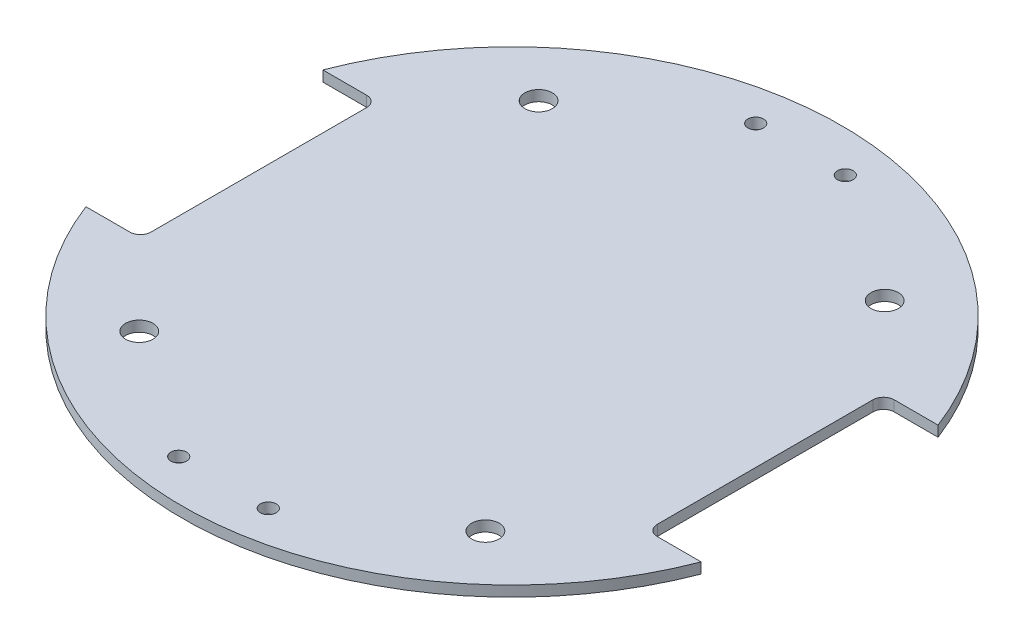
ISO-10303-21;
HEADER;
FILE_DESCRIPTION(('STEP AP214'),'2;1');
FILE_NAME('part.step','',(''),(''),'','','');
FILE_SCHEMA(('AUTOMOTIVE_DESIGN { 1 0 10303 214 1 1 1 1 }'));
ENDSEC;
DATA;
#1=APPLICATION_CONTEXT('core data for automotive mechanical design processes');
#2=APPLICATION_PROTOCOL_DEFINITION('international standard','automotive_design',2000,#1);
#3=PRODUCT_CONTEXT('',#1,'mechanical');
#4=PRODUCT('Part','Part','',(#3));
#5=PRODUCT_RELATED_PRODUCT_CATEGORY('part','',(#4));
#6=PRODUCT_DEFINITION_FORMATION('','',#4);
#7=PRODUCT_DEFINITION_CONTEXT('part definition',#1,'design');
#8=PRODUCT_DEFINITION('design','',#6,#7);
#9=PRODUCT_DEFINITION_SHAPE('','',#8);
#10=(LENGTH_UNIT() NAMED_UNIT(*) SI_UNIT(.MILLI.,.METRE.));
#11=(NAMED_UNIT(*) PLANE_ANGLE_UNIT() SI_UNIT($,.RADIAN.));
#12=(NAMED_UNIT(*) SI_UNIT($,.STERADIAN.) SOLID_ANGLE_UNIT());
#13=UNCERTAINTY_MEASURE_WITH_UNIT(LENGTH_MEASURE(1.E-05),#10,'distance_accuracy_value','');
#14=(GEOMETRIC_REPRESENTATION_CONTEXT(3) GLOBAL_UNCERTAINTY_ASSIGNED_CONTEXT((#13)) GLOBAL_UNIT_ASSIGNED_CONTEXT((#10,
#11,#12)) REPRESENTATION_CONTEXT('',''));
#15=CARTESIAN_POINT('',(0.,0.,0.));
#16=DIRECTION('',(0.,0.,1.));
#17=DIRECTION('',(1.,0.,0.));
#18=AXIS2_PLACEMENT_3D('',#15,#16,#17);
#19=CARTESIAN_POINT('',(0.,1.5875,0.));
#20=DIRECTION('',(0.,1.,0.));
#21=DIRECTION('',(0.,0.,1.));
#22=AXIS2_PLACEMENT_3D('',#19,#20,#21);
#23=PLANE('',#22);
#24=CARTESIAN_POINT('',(6.73100000000001,1.5875,-43.35));
#25=DIRECTION('',(0.,-1.,0.));
#26=DIRECTION('',(0.,0.,-1.));
#27=AXIS2_PLACEMENT_3D('',#24,#25,#26);
#28=CIRCLE('',#27,1.18);
#29=CARTESIAN_POINT('',(6.73100000000001,1.5875,-44.53));
#30=VERTEX_POINT('',#29);
#31=EDGE_CURVE('E390',#30,#30,#28,.T.);
#32=ORIENTED_EDGE('',*,*,#31,.T.);
#33=EDGE_LOOP('',(#32));
#34=FACE_BOUND('',#33,.T.);
#35=CARTESIAN_POINT('',(6.73100000000001,1.5875,43.35));
#36=DIRECTION('',(0.,1.,0.));
#37=DIRECTION('',(0.,0.,1.));
#38=AXIS2_PLACEMENT_3D('',#35,#36,#37);
#39=CIRCLE('',#38,1.18);
#40=CARTESIAN_POINT('',(6.73100000000001,1.5875,44.53));
#41=VERTEX_POINT('',#40);
#42=EDGE_CURVE('E396',#41,#41,#39,.T.);
#43=ORIENTED_EDGE('',*,*,#42,.F.);
#44=EDGE_LOOP('',(#43));
#45=FACE_BOUND('',#44,.T.);
#46=CARTESIAN_POINT('',(26.,1.5875,30.));
#47=DIRECTION('',(0.,-1.,0.));
#48=DIRECTION('',(0.,0.,-1.));
#49=AXIS2_PLACEMENT_3D('',#46,#47,#48);
#50=CIRCLE('',#49,2.06375);
#51=CARTESIAN_POINT('',(26.,1.5875,27.93625));
#52=VERTEX_POINT('',#51);
#53=EDGE_CURVE('E206',#52,#52,#50,.T.);
#54=ORIENTED_EDGE('',*,*,#53,.T.);
#55=EDGE_LOOP('',(#54));
#56=FACE_BOUND('',#55,.T.);
#57=CARTESIAN_POINT('',(-26.,1.5875,30.));
#58=DIRECTION('',(0.,1.,0.));
#59=DIRECTION('',(0.,0.,-1.));
#60=AXIS2_PLACEMENT_3D('',#57,#58,#59);
#61=CIRCLE('',#60,2.06375);
#62=CARTESIAN_POINT('',(-26.,1.5875,27.93625));
#63=VERTEX_POINT('',#62);
#64=EDGE_CURVE('E202',#63,#63,#61,.T.);
#65=ORIENTED_EDGE('',*,*,#64,.F.);
#66=EDGE_LOOP('',(#65));
#67=FACE_BOUND('',#66,.T.);
#68=CARTESIAN_POINT('',(26.,1.5875,-30.));
#69=DIRECTION('',(0.,1.,0.));
#70=DIRECTION('',(0.,0.,1.));
#71=AXIS2_PLACEMENT_3D('',#68,#69,#70);
#72=CIRCLE('',#71,2.06375);
#73=CARTESIAN_POINT('',(26.,1.5875,-27.93625));
#74=VERTEX_POINT('',#73);
#75=EDGE_CURVE('E194',#74,#74,#72,.T.);
#76=ORIENTED_EDGE('',*,*,#75,.F.);
#77=EDGE_LOOP('',(#76));
#78=FACE_BOUND('',#77,.T.);
#79=CARTESIAN_POINT('',(-26.,1.5875,-30.));
#80=DIRECTION('',(0.,-1.,0.));
#81=DIRECTION('',(0.,0.,1.));
#82=AXIS2_PLACEMENT_3D('',#79,#80,#81);
#83=CIRCLE('',#82,2.06375);
#84=CARTESIAN_POINT('',(-26.,1.5875,-27.93625));
#85=VERTEX_POINT('',#84);
#86=EDGE_CURVE('E198',#85,#85,#83,.T.);
#87=ORIENTED_EDGE('',*,*,#86,.T.);
#88=EDGE_LOOP('',(#87));
#89=FACE_BOUND('',#88,.T.);
#90=DIRECTION('',(1.,0.,0.));
#91=VECTOR('',#90,1.);
#92=CARTESIAN_POINT('',(-38.03,1.5875,-17.8));
#93=LINE('',#92,#91);
#94=CARTESIAN_POINT('',(-46.221000638238,1.5875,-17.8));
#95=VERTEX_POINT('',#94);
#96=CARTESIAN_POINT('',(-39.63,1.5875,-17.8));
#97=VERTEX_POINT('',#96);
#98=EDGE_CURVE('E162',#95,#97,#93,.T.);
#99=ORIENTED_EDGE('',*,*,#98,.T.);
#100=CARTESIAN_POINT('',(-39.63,1.5875,-16.2));
#101=DIRECTION('',(0.,1.,0.));
#102=DIRECTION('',(0.,0.,1.));
#103=AXIS2_PLACEMENT_3D('',#100,#101,#102);
#104=CIRCLE('',#103,1.6);
#105=CARTESIAN_POINT('',(-38.03,1.5875,-16.2));
#106=VERTEX_POINT('',#105);
#107=EDGE_CURVE('E233',#97,#106,#104,.F.);
#108=ORIENTED_EDGE('',*,*,#107,.T.);
#109=DIRECTION('',(0.,0.,1.));
#110=VECTOR('',#109,1.);
#111=CARTESIAN_POINT('',(-38.03,1.5875,0.));
#112=LINE('',#111,#110);
#113=CARTESIAN_POINT('',(-38.03,1.5875,16.2));
#114=VERTEX_POINT('',#113);
#115=EDGE_CURVE('E237',#106,#114,#112,.T.);
#116=ORIENTED_EDGE('',*,*,#115,.T.);
#117=CARTESIAN_POINT('',(-39.63,1.5875,16.2));
#118=DIRECTION('',(0.,1.,0.));
#119=DIRECTION('',(0.,0.,1.));
#120=AXIS2_PLACEMENT_3D('',#117,#118,#119);
#121=CIRCLE('',#120,1.6);
#122=CARTESIAN_POINT('',(-39.63,1.5875,17.8));
#123=VERTEX_POINT('',#122);
#124=EDGE_CURVE('E76',#114,#123,#121,.F.);
#125=ORIENTED_EDGE('',*,*,#124,.T.);
#126=DIRECTION('',(-1.,0.,0.));
#127=VECTOR('',#126,1.);
#128=CARTESIAN_POINT('',(-38.03,1.5875,17.8));
#129=LINE('',#128,#127);
#130=CARTESIAN_POINT('',(-46.221000638238,1.5875,17.8));
#131=VERTEX_POINT('',#130);
#132=EDGE_CURVE('E402',#123,#131,#129,.T.);
#133=ORIENTED_EDGE('',*,*,#132,.T.);
#134=CARTESIAN_POINT('',(0.,1.5875,0.));
#135=DIRECTION('',(0.,1.,0.));
#136=DIRECTION('',(0.,0.,1.));
#137=AXIS2_PLACEMENT_3D('',#134,#135,#136);
#138=CIRCLE('',#137,49.53);
#139=CARTESIAN_POINT('',(46.221000638238,1.5875,17.8));
#140=VERTEX_POINT('',#139);
#141=EDGE_CURVE('E184',#131,#140,#138,.T.);
#142=ORIENTED_EDGE('',*,*,#141,.T.);
#143=DIRECTION('',(1.,0.,0.));
#144=VECTOR('',#143,1.);
#145=CARTESIAN_POINT('',(38.03,1.5875,17.8));
#146=LINE('',#145,#144);
#147=CARTESIAN_POINT('',(39.63,1.5875,17.8));
#148=VERTEX_POINT('',#147);
#149=EDGE_CURVE('E308',#148,#140,#146,.T.);
#150=ORIENTED_EDGE('',*,*,#149,.F.);
#151=CARTESIAN_POINT('',(39.63,1.5875,16.2));
#152=DIRECTION('',(0.,1.,0.));
#153=DIRECTION('',(0.,0.,1.));
#154=AXIS2_PLACEMENT_3D('',#151,#152,#153);
#155=CIRCLE('',#154,1.6);
#156=CARTESIAN_POINT('',(38.03,1.5875,16.2));
#157=VERTEX_POINT('',#156);
#158=EDGE_CURVE('E221',#148,#157,#155,.F.);
#159=ORIENTED_EDGE('',*,*,#158,.T.);
#160=DIRECTION('',(0.,0.,1.));
#161=VECTOR('',#160,1.);
#162=CARTESIAN_POINT('',(38.03,1.5875,0.));
#163=LINE('',#162,#161);
#164=CARTESIAN_POINT('',(38.03,1.5875,-16.2));
#165=VERTEX_POINT('',#164);
#166=EDGE_CURVE('E305',#165,#157,#163,.T.);
#167=ORIENTED_EDGE('',*,*,#166,.F.);
#168=CARTESIAN_POINT('',(39.63,1.5875,-16.2));
#169=DIRECTION('',(0.,1.,0.));
#170=DIRECTION('',(0.,0.,1.));
#171=AXIS2_PLACEMENT_3D('',#168,#169,#170);
#172=CIRCLE('',#171,1.6);
#173=CARTESIAN_POINT('',(39.63,1.5875,-17.8));
#174=VERTEX_POINT('',#173);
#175=EDGE_CURVE('E217',#165,#174,#172,.F.);
#176=ORIENTED_EDGE('',*,*,#175,.T.);
#177=DIRECTION('',(-1.,0.,0.));
#178=VECTOR('',#177,1.);
#179=CARTESIAN_POINT('',(38.03,1.5875,-17.8));
#180=LINE('',#179,#178);
#181=CARTESIAN_POINT('',(46.221000638238,1.5875,-17.8));
#182=VERTEX_POINT('',#181);
#183=EDGE_CURVE('E310',#182,#174,#180,.T.);
#184=ORIENTED_EDGE('',*,*,#183,.F.);
#185=EDGE_CURVE('E187',#182,#95,#138,.T.);
#186=ORIENTED_EDGE('',*,*,#185,.T.);
#187=EDGE_LOOP('',(#99,#108,#116,#125,#133,#142,#150,#159,#167,#176,#184,#186));
#188=FACE_BOUND('',#187,.T.);
#189=CARTESIAN_POINT('',(-6.73100000000001,1.5875,-43.35));
#190=DIRECTION('',(0.,1.,0.));
#191=DIRECTION('',(0.,0.,-1.));
#192=AXIS2_PLACEMENT_3D('',#189,#190,#191);
#193=CIRCLE('',#192,1.18);
#194=CARTESIAN_POINT('',(-6.73100000000001,1.5875,-44.53));
#195=VERTEX_POINT('',#194);
#196=EDGE_CURVE('E384',#195,#195,#193,.T.);
#197=ORIENTED_EDGE('',*,*,#196,.F.);
#198=EDGE_LOOP('',(#197));
#199=FACE_BOUND('',#198,.T.);
#200=CARTESIAN_POINT('',(-6.73100000000001,1.5875,43.35));
#201=DIRECTION('',(0.,-1.,0.));
#202=DIRECTION('',(0.,0.,1.));
#203=AXIS2_PLACEMENT_3D('',#200,#201,#202);
#204=CIRCLE('',#203,1.18);
#205=CARTESIAN_POINT('',(-6.73100000000001,1.5875,44.53));
#206=VERTEX_POINT('',#205);
#207=EDGE_CURVE('E381',#206,#206,#204,.T.);
#208=ORIENTED_EDGE('',*,*,#207,.T.);
#209=EDGE_LOOP('',(#208));
#210=FACE_BOUND('',#209,.T.);
#211=ADVANCED_FACE('F68',(#34,#45,#56,#67,#78,#89,#188,#199,#210),#23,.T.);
#212=CARTESIAN_POINT('',(0.,0.,0.));
#213=DIRECTION('',(0.,1.,0.));
#214=DIRECTION('',(0.,0.,1.));
#215=AXIS2_PLACEMENT_3D('',#212,#213,#214);
#216=PLANE('',#215);
#217=CARTESIAN_POINT('',(6.73100000000001,0.,-43.35));
#218=DIRECTION('',(0.,-1.,0.));
#219=DIRECTION('',(0.,0.,-1.));
#220=AXIS2_PLACEMENT_3D('',#217,#218,#219);
#221=CIRCLE('',#220,1.18);
#222=CARTESIAN_POINT('',(6.73100000000001,0.,-44.53));
#223=VERTEX_POINT('',#222);
#224=EDGE_CURVE('E393',#223,#223,#221,.T.);
#225=ORIENTED_EDGE('',*,*,#224,.F.);
#226=EDGE_LOOP('',(#225));
#227=FACE_BOUND('',#226,.T.);
#228=CARTESIAN_POINT('',(6.73100000000001,0.,43.35));
#229=DIRECTION('',(0.,1.,0.));
#230=DIRECTION('',(0.,0.,1.));
#231=AXIS2_PLACEMENT_3D('',#228,#229,#230);
#232=CIRCLE('',#231,1.18);
#233=CARTESIAN_POINT('',(6.73100000000001,0.,44.53));
#234=VERTEX_POINT('',#233);
#235=EDGE_CURVE('E244',#234,#234,#232,.T.);
#236=ORIENTED_EDGE('',*,*,#235,.T.);
#237=EDGE_LOOP('',(#236));
#238=FACE_BOUND('',#237,.T.);
#239=CARTESIAN_POINT('',(26.,0.,30.));
#240=DIRECTION('',(0.,1.,0.));
#241=DIRECTION('',(0.,0.,1.));
#242=AXIS2_PLACEMENT_3D('',#239,#240,#241);
#243=CIRCLE('',#242,2.06375);
#244=CARTESIAN_POINT('',(26.,0.,32.06375));
#245=VERTEX_POINT('',#244);
#246=EDGE_CURVE('E203',#245,#245,#243,.F.);
#247=ORIENTED_EDGE('',*,*,#246,.F.);
#248=EDGE_LOOP('',(#247));
#249=FACE_BOUND('',#248,.T.);
#250=CARTESIAN_POINT('',(-26.,0.,30.));
#251=DIRECTION('',(0.,1.,0.));
#252=DIRECTION('',(0.,0.,1.));
#253=AXIS2_PLACEMENT_3D('',#250,#251,#252);
#254=CIRCLE('',#253,2.06375);
#255=CARTESIAN_POINT('',(-26.,0.,32.06375));
#256=VERTEX_POINT('',#255);
#257=EDGE_CURVE('E199',#256,#256,#254,.T.);
#258=ORIENTED_EDGE('',*,*,#257,.T.);
#259=EDGE_LOOP('',(#258));
#260=FACE_BOUND('',#259,.T.);
#261=CARTESIAN_POINT('',(26.,0.,-30.));
#262=DIRECTION('',(0.,1.,0.));
#263=DIRECTION('',(0.,0.,1.));
#264=AXIS2_PLACEMENT_3D('',#261,#262,#263);
#265=CIRCLE('',#264,2.06375);
#266=CARTESIAN_POINT('',(26.,0.,-27.93625));
#267=VERTEX_POINT('',#266);
#268=EDGE_CURVE('E189',#267,#267,#265,.T.);
#269=ORIENTED_EDGE('',*,*,#268,.T.);
#270=EDGE_LOOP('',(#269));
#271=FACE_BOUND('',#270,.T.);
#272=CARTESIAN_POINT('',(-26.,0.,-30.));
#273=DIRECTION('',(0.,1.,0.));
#274=DIRECTION('',(0.,0.,1.));
#275=AXIS2_PLACEMENT_3D('',#272,#273,#274);
#276=CIRCLE('',#275,2.06375);
#277=CARTESIAN_POINT('',(-26.,0.,-27.93625));
#278=VERTEX_POINT('',#277);
#279=EDGE_CURVE('E195',#278,#278,#276,.F.);
#280=ORIENTED_EDGE('',*,*,#279,.F.);
#281=EDGE_LOOP('',(#280));
#282=FACE_BOUND('',#281,.T.);
#283=DIRECTION('',(-1.,0.,0.));
#284=VECTOR('',#283,1.);
#285=CARTESIAN_POINT('',(-38.03,0.,17.8));
#286=LINE('',#285,#284);
#287=CARTESIAN_POINT('',(-39.63,0.,17.8));
#288=VERTEX_POINT('',#287);
#289=CARTESIAN_POINT('',(-46.221000638238,0.,17.8));
#290=VERTEX_POINT('',#289);
#291=EDGE_CURVE('E168',#288,#290,#286,.T.);
#292=ORIENTED_EDGE('',*,*,#291,.F.);
#293=CARTESIAN_POINT('',(-39.63,0.,16.2));
#294=DIRECTION('',(0.,1.,0.));
#295=DIRECTION('',(0.,0.,1.));
#296=AXIS2_PLACEMENT_3D('',#293,#294,#295);
#297=CIRCLE('',#296,1.6);
#298=CARTESIAN_POINT('',(-38.03,0.,16.2));
#299=VERTEX_POINT('',#298);
#300=EDGE_CURVE('E12',#288,#299,#297,.T.);
#301=ORIENTED_EDGE('',*,*,#300,.T.);
#302=DIRECTION('',(0.,0.,1.));
#303=VECTOR('',#302,1.);
#304=CARTESIAN_POINT('',(-38.03,0.,0.));
#305=LINE('',#304,#303);
#306=CARTESIAN_POINT('',(-38.03,0.,-16.2));
#307=VERTEX_POINT('',#306);
#308=EDGE_CURVE('E179',#307,#299,#305,.T.);
#309=ORIENTED_EDGE('',*,*,#308,.F.);
#310=CARTESIAN_POINT('',(-39.63,0.,-16.2));
#311=DIRECTION('',(0.,1.,0.));
#312=DIRECTION('',(0.,0.,1.));
#313=AXIS2_PLACEMENT_3D('',#310,#311,#312);
#314=CIRCLE('',#313,1.6);
#315=CARTESIAN_POINT('',(-39.63,0.,-17.8));
#316=VERTEX_POINT('',#315);
#317=EDGE_CURVE('E178',#307,#316,#314,.T.);
#318=ORIENTED_EDGE('',*,*,#317,.T.);
#319=DIRECTION('',(1.,0.,0.));
#320=VECTOR('',#319,1.);
#321=CARTESIAN_POINT('',(-38.03,0.,-17.8));
#322=LINE('',#321,#320);
#323=CARTESIAN_POINT('',(-46.221000638238,0.,-17.8));
#324=VERTEX_POINT('',#323);
#325=EDGE_CURVE('E159',#324,#316,#322,.T.);
#326=ORIENTED_EDGE('',*,*,#325,.F.);
#327=CARTESIAN_POINT('',(0.,0.,0.));
#328=DIRECTION('',(0.,1.,0.));
#329=DIRECTION('',(0.,0.,1.));
#330=AXIS2_PLACEMENT_3D('',#327,#328,#329);
#331=CIRCLE('',#330,49.53);
#332=CARTESIAN_POINT('',(46.221000638238,0.,-17.8));
#333=VERTEX_POINT('',#332);
#334=EDGE_CURVE('E175',#333,#324,#331,.T.);
#335=ORIENTED_EDGE('',*,*,#334,.F.);
#336=DIRECTION('',(-1.,0.,0.));
#337=VECTOR('',#336,1.);
#338=CARTESIAN_POINT('',(38.03,0.,-17.8));
#339=LINE('',#338,#337);
#340=CARTESIAN_POINT('',(39.63,0.,-17.8));
#341=VERTEX_POINT('',#340);
#342=EDGE_CURVE('E302',#333,#341,#339,.T.);
#343=ORIENTED_EDGE('',*,*,#342,.T.);
#344=CARTESIAN_POINT('',(39.63,0.,-16.2));
#345=DIRECTION('',(0.,1.,0.));
#346=DIRECTION('',(0.,0.,1.));
#347=AXIS2_PLACEMENT_3D('',#344,#345,#346);
#348=CIRCLE('',#347,1.6);
#349=CARTESIAN_POINT('',(38.03,0.,-16.2));
#350=VERTEX_POINT('',#349);
#351=EDGE_CURVE('E219',#341,#350,#348,.T.);
#352=ORIENTED_EDGE('',*,*,#351,.T.);
#353=DIRECTION('',(0.,0.,1.));
#354=VECTOR('',#353,1.);
#355=CARTESIAN_POINT('',(38.03,0.,0.));
#356=LINE('',#355,#354);
#357=CARTESIAN_POINT('',(38.03,0.,16.2));
#358=VERTEX_POINT('',#357);
#359=EDGE_CURVE('E296',#350,#358,#356,.T.);
#360=ORIENTED_EDGE('',*,*,#359,.T.);
#361=CARTESIAN_POINT('',(39.63,0.,16.2));
#362=DIRECTION('',(0.,1.,0.));
#363=DIRECTION('',(0.,0.,1.));
#364=AXIS2_PLACEMENT_3D('',#361,#362,#363);
#365=CIRCLE('',#364,1.6);
#366=CARTESIAN_POINT('',(39.63,0.,17.8));
#367=VERTEX_POINT('',#366);
#368=EDGE_CURVE('E223',#358,#367,#365,.T.);
#369=ORIENTED_EDGE('',*,*,#368,.T.);
#370=DIRECTION('',(1.,0.,0.));
#371=VECTOR('',#370,1.);
#372=CARTESIAN_POINT('',(38.03,0.,17.8));
#373=LINE('',#372,#371);
#374=CARTESIAN_POINT('',(46.221000638238,0.,17.8));
#375=VERTEX_POINT('',#374);
#376=EDGE_CURVE('E293',#367,#375,#373,.T.);
#377=ORIENTED_EDGE('',*,*,#376,.T.);
#378=EDGE_CURVE('E185',#290,#375,#331,.T.);
#379=ORIENTED_EDGE('',*,*,#378,.F.);
#380=EDGE_LOOP('',(#292,#301,#309,#318,#326,#335,#343,#352,#360,#369,#377,#379));
#381=FACE_BOUND('',#380,.T.);
#382=CARTESIAN_POINT('',(-6.73100000000001,0.,-43.35));
#383=DIRECTION('',(0.,1.,0.));
#384=DIRECTION('',(0.,0.,-1.));
#385=AXIS2_PLACEMENT_3D('',#382,#383,#384);
#386=CIRCLE('',#385,1.18);
#387=CARTESIAN_POINT('',(-6.73100000000001,0.,-44.53));
#388=VERTEX_POINT('',#387);
#389=EDGE_CURVE('E387',#388,#388,#386,.T.);
#390=ORIENTED_EDGE('',*,*,#389,.T.);
#391=EDGE_LOOP('',(#390));
#392=FACE_BOUND('',#391,.T.);
#393=CARTESIAN_POINT('',(-6.73100000000001,0.,43.35));
#394=DIRECTION('',(0.,-1.,0.));
#395=DIRECTION('',(0.,0.,1.));
#396=AXIS2_PLACEMENT_3D('',#393,#394,#395);
#397=CIRCLE('',#396,1.18);
#398=CARTESIAN_POINT('',(-6.73100000000001,0.,44.53));
#399=VERTEX_POINT('',#398);
#400=EDGE_CURVE('E378',#399,#399,#397,.T.);
#401=ORIENTED_EDGE('',*,*,#400,.F.);
#402=EDGE_LOOP('',(#401));
#403=FACE_BOUND('',#402,.T.);
#404=ADVANCED_FACE('F172',(#227,#238,#249,#260,#271,#282,#381,#392,#403),#216,.F.);
#405=CARTESIAN_POINT('',(0.,1.5875,0.));
#406=DIRECTION('',(0.,-1.,0.));
#407=DIRECTION('',(0.,0.,-1.));
#408=AXIS2_PLACEMENT_3D('',#405,#406,#407);
#409=CYLINDRICAL_SURFACE('',#408,49.53);
#410=DIRECTION('',(0.,1.,0.));
#411=VECTOR('',#410,1.);
#412=CARTESIAN_POINT('',(-46.221000638238,0.,17.8));
#413=LINE('',#412,#411);
#414=EDGE_CURVE('E167',#290,#131,#413,.T.);
#415=ORIENTED_EDGE('',*,*,#414,.F.);
#416=ORIENTED_EDGE('',*,*,#378,.T.);
#417=DIRECTION('',(0.,1.,0.));
#418=VECTOR('',#417,1.);
#419=CARTESIAN_POINT('',(46.221000638238,0.,17.8));
#420=LINE('',#419,#418);
#421=EDGE_CURVE('E301',#375,#140,#420,.T.);
#422=ORIENTED_EDGE('',*,*,#421,.T.);
#423=ORIENTED_EDGE('',*,*,#141,.F.);
#424=EDGE_LOOP('',(#415,#416,#422,#423));
#425=FACE_BOUND('',#424,.T.);
#426=ADVANCED_FACE('F262',(#425),#409,.T.);
#427=DIRECTION('',(0.,1.,0.));
#428=VECTOR('',#427,1.);
#429=CARTESIAN_POINT('',(-46.221000638238,0.,-17.8));
#430=LINE('',#429,#428);
#431=EDGE_CURVE('E155',#324,#95,#430,.T.);
#432=ORIENTED_EDGE('',*,*,#431,.T.);
#433=ORIENTED_EDGE('',*,*,#185,.F.);
#434=DIRECTION('',(0.,1.,0.));
#435=VECTOR('',#434,1.);
#436=CARTESIAN_POINT('',(46.221000638238,0.,-17.8));
#437=LINE('',#436,#435);
#438=EDGE_CURVE('E183',#333,#182,#437,.T.);
#439=ORIENTED_EDGE('',*,*,#438,.F.);
#440=ORIENTED_EDGE('',*,*,#334,.T.);
#441=EDGE_LOOP('',(#432,#433,#439,#440));
#442=FACE_BOUND('',#441,.T.);
#443=ADVANCED_FACE('F182',(#442),#409,.T.);
#444=CARTESIAN_POINT('',(26.,-8.4125,-30.));
#445=DIRECTION('',(0.,1.,0.));
#446=DIRECTION('',(0.,0.,1.));
#447=AXIS2_PLACEMENT_3D('',#444,#445,#446);
#448=CYLINDRICAL_SURFACE('',#447,2.06375);
#449=ORIENTED_EDGE('',*,*,#75,.T.);
#450=EDGE_LOOP('',(#449));
#451=FACE_BOUND('',#450,.T.);
#452=ORIENTED_EDGE('',*,*,#268,.F.);
#453=EDGE_LOOP('',(#452));
#454=FACE_BOUND('',#453,.T.);
#455=ADVANCED_FACE('F268',(#451,#454),#448,.F.);
#456=CARTESIAN_POINT('',(-26.,-8.4125,-30.));
#457=DIRECTION('',(0.,1.,0.));
#458=DIRECTION('',(0.,0.,1.));
#459=AXIS2_PLACEMENT_3D('',#456,#457,#458);
#460=CYLINDRICAL_SURFACE('',#459,2.06375);
#461=ORIENTED_EDGE('',*,*,#86,.F.);
#462=EDGE_LOOP('',(#461));
#463=FACE_BOUND('',#462,.T.);
#464=ORIENTED_EDGE('',*,*,#279,.T.);
#465=EDGE_LOOP('',(#464));
#466=FACE_BOUND('',#465,.T.);
#467=ADVANCED_FACE('F330',(#463,#466),#460,.F.);
#468=CARTESIAN_POINT('',(-26.,-8.4125,30.));
#469=DIRECTION('',(0.,1.,0.));
#470=DIRECTION('',(0.,0.,1.));
#471=AXIS2_PLACEMENT_3D('',#468,#469,#470);
#472=CYLINDRICAL_SURFACE('',#471,2.06375);
#473=ORIENTED_EDGE('',*,*,#64,.T.);
#474=EDGE_LOOP('',(#473));
#475=FACE_BOUND('',#474,.T.);
#476=ORIENTED_EDGE('',*,*,#257,.F.);
#477=EDGE_LOOP('',(#476));
#478=FACE_BOUND('',#477,.T.);
#479=ADVANCED_FACE('F333',(#475,#478),#472,.F.);
#480=CARTESIAN_POINT('',(26.,-8.4125,30.));
#481=DIRECTION('',(0.,1.,0.));
#482=DIRECTION('',(0.,0.,1.));
#483=AXIS2_PLACEMENT_3D('',#480,#481,#482);
#484=CYLINDRICAL_SURFACE('',#483,2.06375);
#485=ORIENTED_EDGE('',*,*,#53,.F.);
#486=EDGE_LOOP('',(#485));
#487=FACE_BOUND('',#486,.T.);
#488=ORIENTED_EDGE('',*,*,#246,.T.);
#489=EDGE_LOOP('',(#488));
#490=FACE_BOUND('',#489,.T.);
#491=ADVANCED_FACE('F340',(#487,#490),#484,.F.);
#492=CARTESIAN_POINT('',(38.03,0.,0.));
#493=DIRECTION('',(-1.,0.,0.));
#494=DIRECTION('',(0.,0.,1.));
#495=AXIS2_PLACEMENT_3D('',#492,#493,#494);
#496=PLANE('',#495);
#497=ORIENTED_EDGE('',*,*,#359,.F.);
#498=DIRECTION('',(0.,1.,0.));
#499=VECTOR('',#498,1.);
#500=CARTESIAN_POINT('',(38.03,1.5875,-16.2));
#501=LINE('',#500,#499);
#502=EDGE_CURVE('E209',#350,#165,#501,.T.);
#503=ORIENTED_EDGE('',*,*,#502,.T.);
#504=ORIENTED_EDGE('',*,*,#166,.T.);
#505=DIRECTION('',(0.,1.,0.));
#506=VECTOR('',#505,1.);
#507=CARTESIAN_POINT('',(38.03,0.,16.2));
#508=LINE('',#507,#506);
#509=EDGE_CURVE('E207',#157,#358,#508,.F.);
#510=ORIENTED_EDGE('',*,*,#509,.T.);
#511=EDGE_LOOP('',(#497,#503,#504,#510));
#512=FACE_BOUND('',#511,.T.);
#513=ADVANCED_FACE('F346',(#512),#496,.F.);
#514=CARTESIAN_POINT('',(38.03,0.,-17.8));
#515=DIRECTION('',(0.,0.,-1.));
#516=DIRECTION('',(-1.,0.,0.));
#517=AXIS2_PLACEMENT_3D('',#514,#515,#516);
#518=PLANE('',#517);
#519=ORIENTED_EDGE('',*,*,#183,.T.);
#520=DIRECTION('',(0.,1.,0.));
#521=VECTOR('',#520,1.);
#522=CARTESIAN_POINT('',(39.63,0.,-17.8));
#523=LINE('',#522,#521);
#524=EDGE_CURVE('E212',#174,#341,#523,.F.);
#525=ORIENTED_EDGE('',*,*,#524,.T.);
#526=ORIENTED_EDGE('',*,*,#342,.F.);
#527=ORIENTED_EDGE('',*,*,#438,.T.);
#528=EDGE_LOOP('',(#519,#525,#526,#527));
#529=FACE_BOUND('',#528,.T.);
#530=ADVANCED_FACE('F350',(#529),#518,.F.);
#531=CARTESIAN_POINT('',(38.03,0.,17.8));
#532=DIRECTION('',(0.,0.,1.));
#533=DIRECTION('',(1.,0.,0.));
#534=AXIS2_PLACEMENT_3D('',#531,#532,#533);
#535=PLANE('',#534);
#536=ORIENTED_EDGE('',*,*,#376,.F.);
#537=DIRECTION('',(0.,1.,0.));
#538=VECTOR('',#537,1.);
#539=CARTESIAN_POINT('',(39.63,1.5875,17.8));
#540=LINE('',#539,#538);
#541=EDGE_CURVE('E214',#367,#148,#540,.T.);
#542=ORIENTED_EDGE('',*,*,#541,.T.);
#543=ORIENTED_EDGE('',*,*,#149,.T.);
#544=ORIENTED_EDGE('',*,*,#421,.F.);
#545=EDGE_LOOP('',(#536,#542,#543,#544));
#546=FACE_BOUND('',#545,.T.);
#547=ADVANCED_FACE('F277',(#546),#535,.F.);
#548=CARTESIAN_POINT('',(39.63,0.,-16.2));
#549=DIRECTION('',(0.,-1.,0.));
#550=DIRECTION('',(0.,0.,-1.));
#551=AXIS2_PLACEMENT_3D('',#548,#549,#550);
#552=CYLINDRICAL_SURFACE('',#551,1.6);
#553=ORIENTED_EDGE('',*,*,#351,.F.);
#554=ORIENTED_EDGE('',*,*,#524,.F.);
#555=ORIENTED_EDGE('',*,*,#175,.F.);
#556=ORIENTED_EDGE('',*,*,#502,.F.);
#557=EDGE_LOOP('',(#553,#554,#555,#556));
#558=FACE_BOUND('',#557,.T.);
#559=ADVANCED_FACE('F274',(#558),#552,.F.);
#560=CARTESIAN_POINT('',(39.63,0.,16.2));
#561=DIRECTION('',(0.,-1.,0.));
#562=DIRECTION('',(0.,0.,-1.));
#563=AXIS2_PLACEMENT_3D('',#560,#561,#562);
#564=CYLINDRICAL_SURFACE('',#563,1.6);
#565=ORIENTED_EDGE('',*,*,#368,.F.);
#566=ORIENTED_EDGE('',*,*,#509,.F.);
#567=ORIENTED_EDGE('',*,*,#158,.F.);
#568=ORIENTED_EDGE('',*,*,#541,.F.);
#569=EDGE_LOOP('',(#565,#566,#567,#568));
#570=FACE_BOUND('',#569,.T.);
#571=ADVANCED_FACE('F276',(#570),#564,.F.);
#572=CARTESIAN_POINT('',(-38.03,0.,17.8));
#573=DIRECTION('',(0.,0.,-1.));
#574=DIRECTION('',(-1.,0.,0.));
#575=AXIS2_PLACEMENT_3D('',#572,#573,#574);
#576=PLANE('',#575);
#577=ORIENTED_EDGE('',*,*,#132,.F.);
#578=DIRECTION('',(0.,1.,0.));
#579=VECTOR('',#578,1.);
#580=CARTESIAN_POINT('',(-39.63,0.,17.8));
#581=LINE('',#580,#579);
#582=EDGE_CURVE('E83',#123,#288,#581,.F.);
#583=ORIENTED_EDGE('',*,*,#582,.T.);
#584=ORIENTED_EDGE('',*,*,#291,.T.);
#585=ORIENTED_EDGE('',*,*,#414,.T.);
#586=EDGE_LOOP('',(#577,#583,#584,#585));
#587=FACE_BOUND('',#586,.T.);
#588=ADVANCED_FACE('F280',(#587),#576,.T.);
#589=CARTESIAN_POINT('',(-38.03,0.,-17.8));
#590=DIRECTION('',(0.,0.,1.));
#591=DIRECTION('',(1.,0.,0.));
#592=AXIS2_PLACEMENT_3D('',#589,#590,#591);
#593=PLANE('',#592);
#594=ORIENTED_EDGE('',*,*,#325,.T.);
#595=DIRECTION('',(0.,1.,0.));
#596=VECTOR('',#595,1.);
#597=CARTESIAN_POINT('',(-39.63,1.5875,-17.8));
#598=LINE('',#597,#596);
#599=EDGE_CURVE('E225',#316,#97,#598,.T.);
#600=ORIENTED_EDGE('',*,*,#599,.T.);
#601=ORIENTED_EDGE('',*,*,#98,.F.);
#602=ORIENTED_EDGE('',*,*,#431,.F.);
#603=EDGE_LOOP('',(#594,#600,#601,#602));
#604=FACE_BOUND('',#603,.T.);
#605=ADVANCED_FACE('F157',(#604),#593,.T.);
#606=CARTESIAN_POINT('',(-38.03,0.,0.));
#607=DIRECTION('',(-1.,0.,0.));
#608=DIRECTION('',(0.,0.,1.));
#609=AXIS2_PLACEMENT_3D('',#606,#607,#608);
#610=PLANE('',#609);
#611=ORIENTED_EDGE('',*,*,#115,.F.);
#612=DIRECTION('',(0.,1.,0.));
#613=VECTOR('',#612,1.);
#614=CARTESIAN_POINT('',(-38.03,0.,-16.2));
#615=LINE('',#614,#613);
#616=EDGE_CURVE('E230',#106,#307,#615,.F.);
#617=ORIENTED_EDGE('',*,*,#616,.T.);
#618=ORIENTED_EDGE('',*,*,#308,.T.);
#619=DIRECTION('',(0.,1.,0.));
#620=VECTOR('',#619,1.);
#621=CARTESIAN_POINT('',(-38.03,1.5875,16.2));
#622=LINE('',#621,#620);
#623=EDGE_CURVE('E227',#299,#114,#622,.T.);
#624=ORIENTED_EDGE('',*,*,#623,.T.);
#625=EDGE_LOOP('',(#611,#617,#618,#624));
#626=FACE_BOUND('',#625,.T.);
#627=ADVANCED_FACE('F241',(#626),#610,.T.);
#628=CARTESIAN_POINT('',(-39.63,0.,-16.2));
#629=DIRECTION('',(0.,-1.,0.));
#630=DIRECTION('',(0.,0.,-1.));
#631=AXIS2_PLACEMENT_3D('',#628,#629,#630);
#632=CYLINDRICAL_SURFACE('',#631,1.6);
#633=ORIENTED_EDGE('',*,*,#317,.F.);
#634=ORIENTED_EDGE('',*,*,#616,.F.);
#635=ORIENTED_EDGE('',*,*,#107,.F.);
#636=ORIENTED_EDGE('',*,*,#599,.F.);
#637=EDGE_LOOP('',(#633,#634,#635,#636));
#638=FACE_BOUND('',#637,.T.);
#639=ADVANCED_FACE('F246',(#638),#632,.F.);
#640=CARTESIAN_POINT('',(-39.63,0.,16.2));
#641=DIRECTION('',(0.,-1.,0.));
#642=DIRECTION('',(0.,0.,-1.));
#643=AXIS2_PLACEMENT_3D('',#640,#641,#642);
#644=CYLINDRICAL_SURFACE('',#643,1.6);
#645=ORIENTED_EDGE('',*,*,#300,.F.);
#646=ORIENTED_EDGE('',*,*,#582,.F.);
#647=ORIENTED_EDGE('',*,*,#124,.F.);
#648=ORIENTED_EDGE('',*,*,#623,.F.);
#649=EDGE_LOOP('',(#645,#646,#647,#648));
#650=FACE_BOUND('',#649,.T.);
#651=ADVANCED_FACE('F70',(#650),#644,.F.);
#652=CARTESIAN_POINT('',(6.73100000000001,0.,43.35));
#653=DIRECTION('',(0.,1.,0.));
#654=DIRECTION('',(0.,0.,1.));
#655=AXIS2_PLACEMENT_3D('',#652,#653,#654);
#656=CYLINDRICAL_SURFACE('',#655,1.18);
#657=ORIENTED_EDGE('',*,*,#235,.F.);
#658=EDGE_LOOP('',(#657));
#659=FACE_BOUND('',#658,.T.);
#660=ORIENTED_EDGE('',*,*,#42,.T.);
#661=EDGE_LOOP('',(#660));
#662=FACE_BOUND('',#661,.T.);
#663=ADVANCED_FACE('F252',(#659,#662),#656,.F.);
#664=CARTESIAN_POINT('',(6.73100000000001,0.,-43.35));
#665=DIRECTION('',(0.,1.,0.));
#666=DIRECTION('',(0.,0.,1.));
#667=AXIS2_PLACEMENT_3D('',#664,#665,#666);
#668=CYLINDRICAL_SURFACE('',#667,1.18);
#669=ORIENTED_EDGE('',*,*,#224,.T.);
#670=EDGE_LOOP('',(#669));
#671=FACE_BOUND('',#670,.T.);
#672=ORIENTED_EDGE('',*,*,#31,.F.);
#673=EDGE_LOOP('',(#672));
#674=FACE_BOUND('',#673,.T.);
#675=ADVANCED_FACE('F361',(#671,#674),#668,.F.);
#676=CARTESIAN_POINT('',(-6.73100000000001,0.,-43.35));
#677=DIRECTION('',(0.,1.,0.));
#678=DIRECTION('',(0.,0.,1.));
#679=AXIS2_PLACEMENT_3D('',#676,#677,#678);
#680=CYLINDRICAL_SURFACE('',#679,1.18);
#681=ORIENTED_EDGE('',*,*,#389,.F.);
#682=EDGE_LOOP('',(#681));
#683=FACE_BOUND('',#682,.T.);
#684=ORIENTED_EDGE('',*,*,#196,.T.);
#685=EDGE_LOOP('',(#684));
#686=FACE_BOUND('',#685,.T.);
#687=ADVANCED_FACE('F365',(#683,#686),#680,.F.);
#688=CARTESIAN_POINT('',(-6.73100000000001,0.,43.35));
#689=DIRECTION('',(0.,1.,0.));
#690=DIRECTION('',(0.,0.,1.));
#691=AXIS2_PLACEMENT_3D('',#688,#689,#690);
#692=CYLINDRICAL_SURFACE('',#691,1.18);
#693=ORIENTED_EDGE('',*,*,#400,.T.);
#694=EDGE_LOOP('',(#693));
#695=FACE_BOUND('',#694,.T.);
#696=ORIENTED_EDGE('',*,*,#207,.F.);
#697=EDGE_LOOP('',(#696));
#698=FACE_BOUND('',#697,.T.);
#699=ADVANCED_FACE('F369',(#695,#698),#692,.F.);
#700=CLOSED_SHELL('',(#211,#404,#426,#443,#455,#467,#479,#491,#513,#530,#547,#559,#571,#588,
#605,#627,#639,#651,#663,#675,#687,#699));
#701=MANIFOLD_SOLID_BREP('B2',#700);
#702=ADVANCED_BREP_SHAPE_REPRESENTATION('',(#18,#701),#14);
#703=SHAPE_DEFINITION_REPRESENTATION(#9,#702);
ENDSEC;
END-ISO-10303-21;
